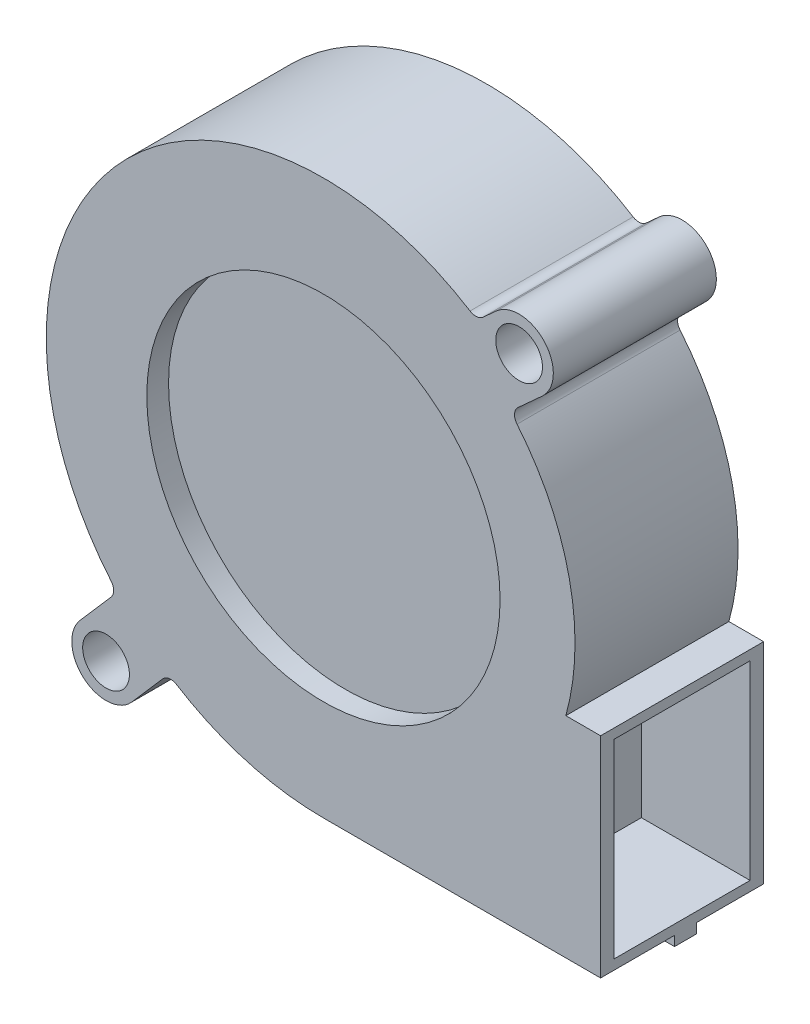
ISO-10303-21;
HEADER;
FILE_DESCRIPTION(('STEP AP214'),'2;1');
FILE_NAME('part.step','',(''),(''),'','','');
FILE_SCHEMA(('AUTOMOTIVE_DESIGN { 1 0 10303 214 1 1 1 1 }'));
ENDSEC;
DATA;
#1=APPLICATION_CONTEXT('core data for automotive mechanical design processes');
#2=APPLICATION_PROTOCOL_DEFINITION('international standard','automotive_design',2000,#1);
#3=PRODUCT_CONTEXT('',#1,'mechanical');
#4=PRODUCT('Part','Part','',(#3));
#5=PRODUCT_RELATED_PRODUCT_CATEGORY('part','',(#4));
#6=PRODUCT_DEFINITION_FORMATION('','',#4);
#7=PRODUCT_DEFINITION_CONTEXT('part definition',#1,'design');
#8=PRODUCT_DEFINITION('design','',#6,#7);
#9=PRODUCT_DEFINITION_SHAPE('','',#8);
#10=(LENGTH_UNIT() NAMED_UNIT(*) SI_UNIT(.MILLI.,.METRE.));
#11=(NAMED_UNIT(*) PLANE_ANGLE_UNIT() SI_UNIT($,.RADIAN.));
#12=(NAMED_UNIT(*) SI_UNIT($,.STERADIAN.) SOLID_ANGLE_UNIT());
#13=UNCERTAINTY_MEASURE_WITH_UNIT(LENGTH_MEASURE(1.E-05),#10,'distance_accuracy_value','');
#14=(GEOMETRIC_REPRESENTATION_CONTEXT(3) GLOBAL_UNCERTAINTY_ASSIGNED_CONTEXT((#13)) GLOBAL_UNIT_ASSIGNED_CONTEXT((#10,
#11,#12)) REPRESENTATION_CONTEXT('',''));
#15=CARTESIAN_POINT('',(0.,0.,0.));
#16=DIRECTION('',(0.,0.,1.));
#17=DIRECTION('',(1.,0.,0.));
#18=AXIS2_PLACEMENT_3D('',#15,#16,#17);
#19=CARTESIAN_POINT('',(-4.17823720879433,4.59639564959305,7.5));
#20=DIRECTION('',(0.67264597252616,-0.739964455662795,0.));
#21=DIRECTION('',(0.739964455662795,0.67264597252616,0.));
#22=AXIS2_PLACEMENT_3D('',#19,#20,#21);
#23=PLANE('',#22);
#24=DIRECTION('',(-0.739964455662795,-0.67264597252616,0.));
#25=VECTOR('',#24,1.);
#26=CARTESIAN_POINT('',(-4.17823720879433,4.59639564959305,-7.5));
#27=LINE('',#26,#25);
#28=CARTESIAN_POINT('',(15.8811651865426,22.8308880353378,-7.5));
#29=VERTEX_POINT('',#28);
#30=CARTESIAN_POINT('',(14.6907431403997,21.7487649835931,-7.5));
#31=VERTEX_POINT('',#30);
#32=EDGE_CURVE('E262',#29,#31,#27,.T.);
#33=ORIENTED_EDGE('',*,*,#32,.T.);
#34=DIRECTION('',(0.,0.,-1.));
#35=VECTOR('',#34,1.);
#36=CARTESIAN_POINT('',(14.6907431403997,21.7487649835931,7.5));
#37=LINE('',#36,#35);
#38=CARTESIAN_POINT('',(14.6907431403997,21.7487649835931,7.5));
#39=VERTEX_POINT('',#38);
#40=EDGE_CURVE('E11',#39,#31,#37,.T.);
#41=ORIENTED_EDGE('',*,*,#40,.F.);
#42=DIRECTION('',(-0.739964455662795,-0.67264597252616,0.));
#43=VECTOR('',#42,1.);
#44=CARTESIAN_POINT('',(-4.17823720879433,4.59639564959305,7.5));
#45=LINE('',#44,#43);
#46=CARTESIAN_POINT('',(15.8811651865426,22.8308880353378,7.5));
#47=VERTEX_POINT('',#46);
#48=EDGE_CURVE('E268',#47,#39,#45,.T.);
#49=ORIENTED_EDGE('',*,*,#48,.F.);
#50=DIRECTION('',(0.,0.,-1.));
#51=VECTOR('',#50,1.);
#52=CARTESIAN_POINT('',(15.8811651865426,22.8308880353378,7.5));
#53=LINE('',#52,#51);
#54=EDGE_CURVE('E311',#47,#29,#53,.T.);
#55=ORIENTED_EDGE('',*,*,#54,.T.);
#56=EDGE_LOOP('',(#33,#41,#49,#55));
#57=FACE_BOUND('',#56,.T.);
#58=ADVANCED_FACE('F36',(#57),#23,.F.);
#59=CARTESIAN_POINT('',(14.0180971678735,22.4887294392559,7.5));
#60=DIRECTION('',(0.,0.,-1.));
#61=DIRECTION('',(-1.,0.,0.));
#62=AXIS2_PLACEMENT_3D('',#59,#60,#61);
#63=CYLINDRICAL_SURFACE('',#62,0.999999999999999);
#64=CARTESIAN_POINT('',(14.0180971678735,22.4887294392559,-7.5));
#65=DIRECTION('',(0.,0.,1.));
#66=DIRECTION('',(1.,0.,0.));
#67=AXIS2_PLACEMENT_3D('',#64,#65,#66);
#68=CIRCLE('',#67,0.999999999999999);
#69=CARTESIAN_POINT('',(13.4891123690858,21.6400981396614,-7.5));
#70=VERTEX_POINT('',#69);
#71=EDGE_CURVE('E314',#31,#70,#68,.F.);
#72=ORIENTED_EDGE('',*,*,#71,.T.);
#73=DIRECTION('',(0.,0.,-1.));
#74=VECTOR('',#73,1.);
#75=CARTESIAN_POINT('',(13.4891123690858,21.6400981396614,7.5));
#76=LINE('',#75,#74);
#77=CARTESIAN_POINT('',(13.4891123690858,21.6400981396614,7.5));
#78=VERTEX_POINT('',#77);
#79=EDGE_CURVE('E43',#78,#70,#76,.T.);
#80=ORIENTED_EDGE('',*,*,#79,.F.);
#81=CARTESIAN_POINT('',(14.0180971678735,22.4887294392559,7.5));
#82=DIRECTION('',(0.,0.,1.));
#83=DIRECTION('',(1.,0.,0.));
#84=AXIS2_PLACEMENT_3D('',#81,#82,#83);
#85=CIRCLE('',#84,0.999999999999999);
#86=EDGE_CURVE('E271',#39,#78,#85,.F.);
#87=ORIENTED_EDGE('',*,*,#86,.F.);
#88=ORIENTED_EDGE('',*,*,#40,.T.);
#89=EDGE_LOOP('',(#72,#80,#87,#88));
#90=FACE_BOUND('',#89,.T.);
#91=ADVANCED_FACE('F416',(#90),#63,.F.);
#92=CARTESIAN_POINT('',(0.,0.,7.5));
#93=DIRECTION('',(0.,0.,-1.));
#94=DIRECTION('',(-1.,0.,0.));
#95=AXIS2_PLACEMENT_3D('',#92,#93,#94);
#96=CYLINDRICAL_SURFACE('',#95,25.5);
#97=CARTESIAN_POINT('',(0.,0.,-7.5));
#98=DIRECTION('',(0.,0.,1.));
#99=DIRECTION('',(1.,0.,0.));
#100=AXIS2_PLACEMENT_3D('',#97,#98,#99);
#101=CIRCLE('',#100,25.5);
#102=CARTESIAN_POINT('',(-19.5395415831544,-16.3846365452573,-7.5));
#103=VERTEX_POINT('',#102);
#104=EDGE_CURVE('E316',#70,#103,#101,.T.);
#105=ORIENTED_EDGE('',*,*,#104,.T.);
#106=DIRECTION('',(0.,0.,-1.));
#107=VECTOR('',#106,1.);
#108=CARTESIAN_POINT('',(-19.5395415831544,-16.3846365452573,7.5));
#109=LINE('',#108,#107);
#110=CARTESIAN_POINT('',(-19.5395415831544,-16.3846365452573,7.5));
#111=VERTEX_POINT('',#110);
#112=EDGE_CURVE('E389',#111,#103,#109,.T.);
#113=ORIENTED_EDGE('',*,*,#112,.F.);
#114=CARTESIAN_POINT('',(0.,0.,7.5));
#115=DIRECTION('',(0.,0.,1.));
#116=DIRECTION('',(1.,0.,0.));
#117=AXIS2_PLACEMENT_3D('',#114,#115,#116);
#118=CIRCLE('',#117,25.5);
#119=EDGE_CURVE('E274',#78,#111,#118,.T.);
#120=ORIENTED_EDGE('',*,*,#119,.F.);
#121=ORIENTED_EDGE('',*,*,#79,.T.);
#122=EDGE_LOOP('',(#105,#113,#120,#121));
#123=FACE_BOUND('',#122,.T.);
#124=ADVANCED_FACE('F396',(#123),#96,.T.);
#125=CARTESIAN_POINT('',(-20.3057981158271,-17.027171311738,7.5));
#126=DIRECTION('',(0.,0.,-1.));
#127=DIRECTION('',(-1.,0.,0.));
#128=AXIS2_PLACEMENT_3D('',#125,#126,#127);
#129=CYLINDRICAL_SURFACE('',#128,0.999999999999999);
#130=CARTESIAN_POINT('',(-20.3057981158271,-17.027171311738,-7.5));
#131=DIRECTION('',(0.,0.,1.));
#132=DIRECTION('',(1.,0.,0.));
#133=AXIS2_PLACEMENT_3D('',#130,#131,#132);
#134=CIRCLE('',#133,0.999999999999999);
#135=CARTESIAN_POINT('',(-19.5511925936636,-17.6833500266628,-7.5));
#136=VERTEX_POINT('',#135);
#137=EDGE_CURVE('E318',#103,#136,#134,.F.);
#138=ORIENTED_EDGE('',*,*,#137,.T.);
#139=DIRECTION('',(0.,0.,-1.));
#140=VECTOR('',#139,1.);
#141=CARTESIAN_POINT('',(-19.5511925936636,-17.6833500266628,7.5));
#142=LINE('',#141,#140);
#143=CARTESIAN_POINT('',(-19.5511925936636,-17.6833500266628,7.5));
#144=VERTEX_POINT('',#143);
#145=EDGE_CURVE('E387',#144,#136,#142,.T.);
#146=ORIENTED_EDGE('',*,*,#145,.F.);
#147=CARTESIAN_POINT('',(-20.3057981158271,-17.027171311738,7.5));
#148=DIRECTION('',(0.,0.,1.));
#149=DIRECTION('',(1.,0.,0.));
#150=AXIS2_PLACEMENT_3D('',#147,#148,#149);
#151=CIRCLE('',#150,0.999999999999999);
#152=EDGE_CURVE('E276',#111,#144,#151,.F.);
#153=ORIENTED_EDGE('',*,*,#152,.F.);
#154=ORIENTED_EDGE('',*,*,#112,.T.);
#155=EDGE_LOOP('',(#138,#146,#153,#154));
#156=FACE_BOUND('',#155,.T.);
#157=ADVANCED_FACE('F408',(#156),#129,.F.);
#158=CARTESIAN_POINT('',(-2.377007394815,2.06696295201305,7.5));
#159=DIRECTION('',(-0.754605522163504,0.656178714924788,0.));
#160=DIRECTION('',(-0.656178714924788,-0.754605522163504,0.));
#161=AXIS2_PLACEMENT_3D('',#158,#159,#160);
#162=PLANE('',#161);
#163=DIRECTION('',(0.656178714924788,0.754605522163504,0.));
#164=VECTOR('',#163,1.);
#165=CARTESIAN_POINT('',(-2.377007394815,2.06696295201305,-7.5));
#166=LINE('',#165,#164);
#167=CARTESIAN_POINT('',(-22.377007394815,-20.9330370479869,-7.5));
#168=VERTEX_POINT('',#167);
#169=EDGE_CURVE('E321',#168,#136,#166,.T.);
#170=ORIENTED_EDGE('',*,*,#169,.F.);
#171=DIRECTION('',(0.,0.,-1.));
#172=VECTOR('',#171,1.);
#173=CARTESIAN_POINT('',(-22.377007394815,-20.9330370479869,7.5));
#174=LINE('',#173,#172);
#175=CARTESIAN_POINT('',(-22.377007394815,-20.9330370479869,7.5));
#176=VERTEX_POINT('',#175);
#177=EDGE_CURVE('E385',#176,#168,#174,.T.);
#178=ORIENTED_EDGE('',*,*,#177,.F.);
#179=DIRECTION('',(0.656178714924788,0.754605522163504,0.));
#180=VECTOR('',#179,1.);
#181=CARTESIAN_POINT('',(-2.377007394815,2.06696295201305,7.5));
#182=LINE('',#181,#180);
#183=EDGE_CURVE('E278',#176,#144,#182,.T.);
#184=ORIENTED_EDGE('',*,*,#183,.T.);
#185=ORIENTED_EDGE('',*,*,#145,.T.);
#186=EDGE_LOOP('',(#170,#178,#184,#185));
#187=FACE_BOUND('',#186,.T.);
#188=ADVANCED_FACE('F471',(#187),#162,.T.);
#189=CARTESIAN_POINT('',(-20.,-23.,7.5));
#190=DIRECTION('',(0.,0.,-1.));
#191=DIRECTION('',(-1.,0.,0.));
#192=AXIS2_PLACEMENT_3D('',#189,#190,#191);
#193=CYLINDRICAL_SURFACE('',#192,3.15);
#194=CARTESIAN_POINT('',(-20.,-23.,-7.5));
#195=DIRECTION('',(0.,0.,1.));
#196=DIRECTION('',(1.,0.,0.));
#197=AXIS2_PLACEMENT_3D('',#194,#195,#196);
#198=CIRCLE('',#197,3.15);
#199=CARTESIAN_POINT('',(-17.622992605185,-25.0669629520131,-7.5));
#200=VERTEX_POINT('',#199);
#201=EDGE_CURVE('E324',#168,#200,#198,.T.);
#202=ORIENTED_EDGE('',*,*,#201,.T.);
#203=DIRECTION('',(0.,0.,-1.));
#204=VECTOR('',#203,1.);
#205=CARTESIAN_POINT('',(-17.622992605185,-25.0669629520131,7.5));
#206=LINE('',#205,#204);
#207=CARTESIAN_POINT('',(-17.622992605185,-25.0669629520131,7.5));
#208=VERTEX_POINT('',#207);
#209=EDGE_CURVE('E382',#208,#200,#206,.T.);
#210=ORIENTED_EDGE('',*,*,#209,.F.);
#211=CARTESIAN_POINT('',(-20.,-23.,7.5));
#212=DIRECTION('',(0.,0.,1.));
#213=DIRECTION('',(1.,0.,0.));
#214=AXIS2_PLACEMENT_3D('',#211,#212,#213);
#215=CIRCLE('',#214,3.15);
#216=EDGE_CURVE('E281',#176,#208,#215,.T.);
#217=ORIENTED_EDGE('',*,*,#216,.F.);
#218=ORIENTED_EDGE('',*,*,#177,.T.);
#219=EDGE_LOOP('',(#202,#210,#217,#218));
#220=FACE_BOUND('',#219,.T.);
#221=ADVANCED_FACE('F469',(#220),#193,.T.);
#222=CARTESIAN_POINT('',(2.37700739481505,-2.06696295201309,7.5));
#223=DIRECTION('',(-0.754605522163504,0.656178714924787,0.));
#224=DIRECTION('',(-0.656178714924787,-0.754605522163505,0.));
#225=AXIS2_PLACEMENT_3D('',#222,#223,#224);
#226=PLANE('',#225);
#227=DIRECTION('',(0.656178714924787,0.754605522163505,0.));
#228=VECTOR('',#227,1.);
#229=CARTESIAN_POINT('',(2.37700739481505,-2.06696295201309,-7.5));
#230=LINE('',#229,#228);
#231=CARTESIAN_POINT('',(-14.7971778040335,-21.8172759306889,-7.5));
#232=VERTEX_POINT('',#231);
#233=EDGE_CURVE('E326',#200,#232,#230,.T.);
#234=ORIENTED_EDGE('',*,*,#233,.T.);
#235=DIRECTION('',(0.,0.,-1.));
#236=VECTOR('',#235,1.);
#237=CARTESIAN_POINT('',(-14.7971778040335,-21.8172759306889,7.5));
#238=LINE('',#237,#236);
#239=CARTESIAN_POINT('',(-14.7971778040335,-21.8172759306889,7.5));
#240=VERTEX_POINT('',#239);
#241=EDGE_CURVE('E379',#240,#232,#238,.T.);
#242=ORIENTED_EDGE('',*,*,#241,.F.);
#243=DIRECTION('',(0.656178714924787,0.754605522163505,0.));
#244=VECTOR('',#243,1.);
#245=CARTESIAN_POINT('',(2.37700739481505,-2.06696295201309,7.5));
#246=LINE('',#245,#244);
#247=EDGE_CURVE('E283',#208,#240,#246,.T.);
#248=ORIENTED_EDGE('',*,*,#247,.F.);
#249=ORIENTED_EDGE('',*,*,#209,.T.);
#250=EDGE_LOOP('',(#234,#242,#248,#249));
#251=FACE_BOUND('',#250,.T.);
#252=ADVANCED_FACE('F465',(#251),#226,.F.);
#253=CARTESIAN_POINT('',(-14.04257228187,-22.4734546456137,7.5));
#254=DIRECTION('',(0.,0.,-1.));
#255=DIRECTION('',(-1.,0.,0.));
#256=AXIS2_PLACEMENT_3D('',#253,#254,#255);
#257=CYLINDRICAL_SURFACE('',#256,0.999999999999999);
#258=CARTESIAN_POINT('',(-14.04257228187,-22.4734546456137,-7.5));
#259=DIRECTION('',(0.,0.,1.));
#260=DIRECTION('',(1.,0.,0.));
#261=AXIS2_PLACEMENT_3D('',#258,#259,#260);
#262=CIRCLE('',#261,0.999999999999999);
#263=CARTESIAN_POINT('',(-13.5126638938749,-21.6253997533264,-7.5));
#264=VERTEX_POINT('',#263);
#265=EDGE_CURVE('E328',#232,#264,#262,.F.);
#266=ORIENTED_EDGE('',*,*,#265,.T.);
#267=DIRECTION('',(0.,0.,-1.));
#268=VECTOR('',#267,1.);
#269=CARTESIAN_POINT('',(-13.5126638938749,-21.6253997533264,7.5));
#270=LINE('',#269,#268);
#271=CARTESIAN_POINT('',(-13.5126638938749,-21.6253997533264,7.5));
#272=VERTEX_POINT('',#271);
#273=EDGE_CURVE('E376',#272,#264,#270,.T.);
#274=ORIENTED_EDGE('',*,*,#273,.F.);
#275=CARTESIAN_POINT('',(-14.04257228187,-22.4734546456137,7.5));
#276=DIRECTION('',(0.,0.,1.));
#277=DIRECTION('',(1.,0.,0.));
#278=AXIS2_PLACEMENT_3D('',#275,#276,#277);
#279=CIRCLE('',#278,0.999999999999999);
#280=EDGE_CURVE('E285',#240,#272,#279,.F.);
#281=ORIENTED_EDGE('',*,*,#280,.F.);
#282=ORIENTED_EDGE('',*,*,#241,.T.);
#283=EDGE_LOOP('',(#266,#274,#281,#282));
#284=FACE_BOUND('',#283,.T.);
#285=ADVANCED_FACE('F460',(#284),#257,.F.);
#286=CARTESIAN_POINT('',(0.,0.,7.5));
#287=DIRECTION('',(0.,0.,-1.));
#288=DIRECTION('',(-1.,0.,0.));
#289=AXIS2_PLACEMENT_3D('',#286,#287,#288);
#290=CYLINDRICAL_SURFACE('',#289,25.5);
#291=CARTESIAN_POINT('',(0.,0.,-7.5));
#292=DIRECTION('',(0.,0.,1.));
#293=DIRECTION('',(1.,0.,0.));
#294=AXIS2_PLACEMENT_3D('',#291,#292,#293);
#295=CIRCLE('',#294,25.5);
#296=CARTESIAN_POINT('',(0.,-25.5,-7.5));
#297=VERTEX_POINT('',#296);
#298=EDGE_CURVE('E330',#264,#297,#295,.T.);
#299=ORIENTED_EDGE('',*,*,#298,.T.);
#300=DIRECTION('',(0.,0.,-1.));
#301=VECTOR('',#300,1.);
#302=CARTESIAN_POINT('',(0.,-25.5,7.5));
#303=LINE('',#302,#301);
#304=CARTESIAN_POINT('',(0.,-25.5,7.5));
#305=VERTEX_POINT('',#304);
#306=EDGE_CURVE('E374',#305,#297,#303,.T.);
#307=ORIENTED_EDGE('',*,*,#306,.F.);
#308=CARTESIAN_POINT('',(0.,0.,7.5));
#309=DIRECTION('',(0.,0.,1.));
#310=DIRECTION('',(1.,0.,0.));
#311=AXIS2_PLACEMENT_3D('',#308,#309,#310);
#312=CIRCLE('',#311,25.5);
#313=EDGE_CURVE('E287',#272,#305,#312,.T.);
#314=ORIENTED_EDGE('',*,*,#313,.F.);
#315=ORIENTED_EDGE('',*,*,#273,.T.);
#316=EDGE_LOOP('',(#299,#307,#314,#315));
#317=FACE_BOUND('',#316,.T.);
#318=ADVANCED_FACE('F455',(#317),#290,.T.);
#319=CARTESIAN_POINT('',(0.,-25.5,7.5));
#320=DIRECTION('',(0.,-1.,0.));
#321=DIRECTION('',(1.,0.,0.));
#322=AXIS2_PLACEMENT_3D('',#319,#320,#321);
#323=PLANE('',#322);
#324=DIRECTION('',(1.,0.,0.));
#325=VECTOR('',#324,1.);
#326=CARTESIAN_POINT('',(14.1,-25.5,0.699999999999999));
#327=LINE('',#326,#325);
#328=CARTESIAN_POINT('',(14.1,-25.5,0.699999999999999));
#329=VERTEX_POINT('',#328);
#330=CARTESIAN_POINT('',(25.5,-25.5,0.699999999999999));
#331=VERTEX_POINT('',#330);
#332=EDGE_CURVE('E259',#329,#331,#327,.T.);
#333=ORIENTED_EDGE('',*,*,#332,.T.);
#334=DIRECTION('',(0.,0.,-1.));
#335=VECTOR('',#334,1.);
#336=CARTESIAN_POINT('',(25.5,-25.5,7.5));
#337=LINE('',#336,#335);
#338=CARTESIAN_POINT('',(25.5,-25.5,7.5));
#339=VERTEX_POINT('',#338);
#340=EDGE_CURVE('E371',#339,#331,#337,.T.);
#341=ORIENTED_EDGE('',*,*,#340,.F.);
#342=DIRECTION('',(-1.,0.,0.));
#343=VECTOR('',#342,1.);
#344=CARTESIAN_POINT('',(0.,-25.5,7.5));
#345=LINE('',#344,#343);
#346=EDGE_CURVE('E289',#339,#305,#345,.T.);
#347=ORIENTED_EDGE('',*,*,#346,.T.);
#348=ORIENTED_EDGE('',*,*,#306,.T.);
#349=DIRECTION('',(-1.,0.,0.));
#350=VECTOR('',#349,1.);
#351=CARTESIAN_POINT('',(0.,-25.5,-7.5));
#352=LINE('',#351,#350);
#353=CARTESIAN_POINT('',(25.5,-25.5,-7.5));
#354=VERTEX_POINT('',#353);
#355=EDGE_CURVE('E333',#354,#297,#352,.T.);
#356=ORIENTED_EDGE('',*,*,#355,.F.);
#357=CARTESIAN_POINT('',(25.5,-25.5,-1.3));
#358=VERTEX_POINT('',#357);
#359=EDGE_CURVE('E370',#358,#354,#337,.T.);
#360=ORIENTED_EDGE('',*,*,#359,.F.);
#361=DIRECTION('',(1.,0.,0.));
#362=VECTOR('',#361,1.);
#363=CARTESIAN_POINT('',(14.1,-25.5,-1.3));
#364=LINE('',#363,#362);
#365=CARTESIAN_POINT('',(14.1,-25.5,-1.3));
#366=VERTEX_POINT('',#365);
#367=EDGE_CURVE('E263',#366,#358,#364,.T.);
#368=ORIENTED_EDGE('',*,*,#367,.F.);
#369=DIRECTION('',(0.,0.,1.));
#370=VECTOR('',#369,1.);
#371=CARTESIAN_POINT('',(14.1,-25.5,0.699999999999999));
#372=LINE('',#371,#370);
#373=EDGE_CURVE('E250',#366,#329,#372,.T.);
#374=ORIENTED_EDGE('',*,*,#373,.T.);
#375=EDGE_LOOP('',(#333,#341,#347,#348,#356,#360,#368,#374));
#376=FACE_BOUND('',#375,.T.);
#377=ADVANCED_FACE('F450',(#376),#323,.T.);
#378=CARTESIAN_POINT('',(25.5,0.,7.5));
#379=DIRECTION('',(-1.,0.,0.));
#380=DIRECTION('',(0.,-1.,0.));
#381=AXIS2_PLACEMENT_3D('',#378,#379,#380);
#382=PLANE('',#381);
#383=DIRECTION('',(0.,0.,-1.));
#384=VECTOR('',#383,1.);
#385=CARTESIAN_POINT('',(25.5,-24.6,6.25));
#386=LINE('',#385,#384);
#387=CARTESIAN_POINT('',(25.5,-24.6,6.25));
#388=VERTEX_POINT('',#387);
#389=CARTESIAN_POINT('',(25.5,-24.6,-6.25));
#390=VERTEX_POINT('',#389);
#391=EDGE_CURVE('E226',#388,#390,#386,.T.);
#392=ORIENTED_EDGE('',*,*,#391,.F.);
#393=DIRECTION('',(0.,-1.,0.));
#394=VECTOR('',#393,1.);
#395=CARTESIAN_POINT('',(25.5,-7.09999999999999,6.25));
#396=LINE('',#395,#394);
#397=CARTESIAN_POINT('',(25.5,-7.09999999999999,6.25));
#398=VERTEX_POINT('',#397);
#399=EDGE_CURVE('E50',#398,#388,#396,.T.);
#400=ORIENTED_EDGE('',*,*,#399,.F.);
#401=DIRECTION('',(0.,0.,1.));
#402=VECTOR('',#401,1.);
#403=CARTESIAN_POINT('',(25.5,-7.09999999999999,6.25));
#404=LINE('',#403,#402);
#405=CARTESIAN_POINT('',(25.5,-7.09999999999999,-6.25));
#406=VERTEX_POINT('',#405);
#407=EDGE_CURVE('E217',#406,#398,#404,.T.);
#408=ORIENTED_EDGE('',*,*,#407,.F.);
#409=DIRECTION('',(0.,1.,0.));
#410=VECTOR('',#409,1.);
#411=CARTESIAN_POINT('',(25.5,-7.09999999999999,-6.25));
#412=LINE('',#411,#410);
#413=EDGE_CURVE('E220',#390,#406,#412,.T.);
#414=ORIENTED_EDGE('',*,*,#413,.F.);
#415=EDGE_LOOP('',(#392,#400,#408,#414));
#416=FACE_BOUND('',#415,.T.);
#417=DIRECTION('',(0.,1.,0.));
#418=VECTOR('',#417,1.);
#419=CARTESIAN_POINT('',(25.5,0.,-7.5));
#420=LINE('',#419,#418);
#421=CARTESIAN_POINT('',(25.5,-6.19999999999999,-7.5));
#422=VERTEX_POINT('',#421);
#423=EDGE_CURVE('E336',#354,#422,#420,.T.);
#424=ORIENTED_EDGE('',*,*,#423,.T.);
#425=DIRECTION('',(0.,0.,-1.));
#426=VECTOR('',#425,1.);
#427=CARTESIAN_POINT('',(25.5,-6.19999999999999,7.5));
#428=LINE('',#427,#426);
#429=CARTESIAN_POINT('',(25.5,-6.19999999999999,7.5));
#430=VERTEX_POINT('',#429);
#431=EDGE_CURVE('E367',#430,#422,#428,.T.);
#432=ORIENTED_EDGE('',*,*,#431,.F.);
#433=DIRECTION('',(0.,1.,0.));
#434=VECTOR('',#433,1.);
#435=CARTESIAN_POINT('',(25.5,0.,7.5));
#436=LINE('',#435,#434);
#437=EDGE_CURVE('E292',#339,#430,#436,.T.);
#438=ORIENTED_EDGE('',*,*,#437,.F.);
#439=ORIENTED_EDGE('',*,*,#340,.T.);
#440=DIRECTION('',(0.,-1.,0.));
#441=VECTOR('',#440,1.);
#442=CARTESIAN_POINT('',(25.5,-25.5,0.699999999999999));
#443=LINE('',#442,#441);
#444=CARTESIAN_POINT('',(25.5,-26.4,0.699999999999999));
#445=VERTEX_POINT('',#444);
#446=EDGE_CURVE('E239',#331,#445,#443,.T.);
#447=ORIENTED_EDGE('',*,*,#446,.T.);
#448=DIRECTION('',(0.,0.,-1.));
#449=VECTOR('',#448,1.);
#450=CARTESIAN_POINT('',(25.5,-26.4,0.699999999999999));
#451=LINE('',#450,#449);
#452=CARTESIAN_POINT('',(25.5,-26.4,-1.3));
#453=VERTEX_POINT('',#452);
#454=EDGE_CURVE('E256',#445,#453,#451,.T.);
#455=ORIENTED_EDGE('',*,*,#454,.T.);
#456=DIRECTION('',(0.,1.,0.));
#457=VECTOR('',#456,1.);
#458=CARTESIAN_POINT('',(25.5,-25.5,-1.3));
#459=LINE('',#458,#457);
#460=EDGE_CURVE('E58',#453,#358,#459,.T.);
#461=ORIENTED_EDGE('',*,*,#460,.T.);
#462=ORIENTED_EDGE('',*,*,#359,.T.);
#463=EDGE_LOOP('',(#424,#432,#438,#439,#447,#455,#461,#462));
#464=FACE_BOUND('',#463,.T.);
#465=ADVANCED_FACE('F444',(#416,#464),#382,.F.);
#466=CARTESIAN_POINT('',(0.,-6.19999999999999,7.5));
#467=DIRECTION('',(0.,-1.,0.));
#468=DIRECTION('',(1.,0.,0.));
#469=AXIS2_PLACEMENT_3D('',#466,#467,#468);
#470=PLANE('',#469);
#471=DIRECTION('',(-1.,0.,0.));
#472=VECTOR('',#471,1.);
#473=CARTESIAN_POINT('',(0.,-6.19999999999999,-7.5));
#474=LINE('',#473,#472);
#475=CARTESIAN_POINT('',(22.3,-6.19999999999999,-7.5));
#476=VERTEX_POINT('',#475);
#477=EDGE_CURVE('E338',#422,#476,#474,.T.);
#478=ORIENTED_EDGE('',*,*,#477,.T.);
#479=DIRECTION('',(0.,0.,-1.));
#480=VECTOR('',#479,1.);
#481=CARTESIAN_POINT('',(22.3,-6.19999999999999,7.5));
#482=LINE('',#481,#480);
#483=CARTESIAN_POINT('',(22.3,-6.19999999999999,7.5));
#484=VERTEX_POINT('',#483);
#485=EDGE_CURVE('E364',#484,#476,#482,.T.);
#486=ORIENTED_EDGE('',*,*,#485,.F.);
#487=DIRECTION('',(-1.,0.,0.));
#488=VECTOR('',#487,1.);
#489=CARTESIAN_POINT('',(0.,-6.19999999999999,7.5));
#490=LINE('',#489,#488);
#491=EDGE_CURVE('E294',#430,#484,#490,.T.);
#492=ORIENTED_EDGE('',*,*,#491,.F.);
#493=ORIENTED_EDGE('',*,*,#431,.T.);
#494=EDGE_LOOP('',(#478,#486,#492,#493));
#495=FACE_BOUND('',#494,.T.);
#496=ADVANCED_FACE('F441',(#495),#470,.F.);
#497=CARTESIAN_POINT('',(0.,0.,7.5));
#498=DIRECTION('',(0.,0.,-1.));
#499=DIRECTION('',(-1.,0.,0.));
#500=AXIS2_PLACEMENT_3D('',#497,#498,#499);
#501=CYLINDRICAL_SURFACE('',#500,23.1458419591943);
#502=CARTESIAN_POINT('',(0.,0.,-7.5));
#503=DIRECTION('',(0.,0.,1.));
#504=DIRECTION('',(1.,0.,0.));
#505=AXIS2_PLACEMENT_3D('',#502,#503,#504);
#506=CIRCLE('',#505,23.1458419591943);
#507=CARTESIAN_POINT('',(17.81145238904,14.781142168079,-7.5));
#508=VERTEX_POINT('',#507);
#509=EDGE_CURVE('E340',#476,#508,#506,.T.);
#510=ORIENTED_EDGE('',*,*,#509,.T.);
#511=DIRECTION('',(0.,0.,-1.));
#512=VECTOR('',#511,1.);
#513=CARTESIAN_POINT('',(17.81145238904,14.781142168079,7.5));
#514=LINE('',#513,#512);
#515=CARTESIAN_POINT('',(17.81145238904,14.781142168079,7.5));
#516=VERTEX_POINT('',#515);
#517=EDGE_CURVE('E361',#516,#508,#514,.T.);
#518=ORIENTED_EDGE('',*,*,#517,.F.);
#519=CARTESIAN_POINT('',(0.,0.,7.5));
#520=DIRECTION('',(0.,0.,1.));
#521=DIRECTION('',(1.,0.,0.));
#522=AXIS2_PLACEMENT_3D('',#519,#520,#521);
#523=CIRCLE('',#522,23.1458419591943);
#524=EDGE_CURVE('E296',#484,#516,#523,.T.);
#525=ORIENTED_EDGE('',*,*,#524,.F.);
#526=ORIENTED_EDGE('',*,*,#485,.T.);
#527=EDGE_LOOP('',(#510,#518,#525,#526));
#528=FACE_BOUND('',#527,.T.);
#529=ADVANCED_FACE('F436',(#528),#501,.T.);
#530=CARTESIAN_POINT('',(18.5809837986314,15.419751132667,7.5));
#531=DIRECTION('',(0.,0.,-1.));
#532=DIRECTION('',(-1.,0.,0.));
#533=AXIS2_PLACEMENT_3D('',#530,#531,#532);
#534=CYLINDRICAL_SURFACE('',#533,0.999999999999999);
#535=CARTESIAN_POINT('',(18.5809837986314,15.419751132667,-7.5));
#536=DIRECTION('',(0.,0.,1.));
#537=DIRECTION('',(1.,0.,0.));
#538=AXIS2_PLACEMENT_3D('',#535,#536,#537);
#539=CIRCLE('',#538,0.999999999999999);
#540=CARTESIAN_POINT('',(17.9083378261053,16.1597155883298,-7.5));
#541=VERTEX_POINT('',#540);
#542=EDGE_CURVE('E342',#508,#541,#539,.F.);
#543=ORIENTED_EDGE('',*,*,#542,.T.);
#544=DIRECTION('',(0.,0.,-1.));
#545=VECTOR('',#544,1.);
#546=CARTESIAN_POINT('',(17.9083378261053,16.1597155883298,7.5));
#547=LINE('',#546,#545);
#548=CARTESIAN_POINT('',(17.9083378261053,16.1597155883298,7.5));
#549=VERTEX_POINT('',#548);
#550=EDGE_CURVE('E359',#549,#541,#547,.T.);
#551=ORIENTED_EDGE('',*,*,#550,.F.);
#552=CARTESIAN_POINT('',(18.5809837986314,15.419751132667,7.5));
#553=DIRECTION('',(0.,0.,1.));
#554=DIRECTION('',(1.,0.,0.));
#555=AXIS2_PLACEMENT_3D('',#552,#553,#554);
#556=CIRCLE('',#555,0.999999999999999);
#557=EDGE_CURVE('E298',#516,#549,#556,.F.);
#558=ORIENTED_EDGE('',*,*,#557,.F.);
#559=ORIENTED_EDGE('',*,*,#517,.T.);
#560=EDGE_LOOP('',(#543,#551,#558,#559));
#561=FACE_BOUND('',#560,.T.);
#562=ADVANCED_FACE('F430',(#561),#534,.F.);
#563=CARTESIAN_POINT('',(0.0594324181204341,-0.0653804210825041,7.5));
#564=DIRECTION('',(0.672645972526158,-0.739964455662796,0.));
#565=DIRECTION('',(0.739964455662796,0.672645972526158,0.));
#566=AXIS2_PLACEMENT_3D('',#563,#564,#565);
#567=PLANE('',#566);
#568=DIRECTION('',(-0.739964455662796,-0.672645972526158,0.));
#569=VECTOR('',#568,1.);
#570=CARTESIAN_POINT('',(0.0594324181204341,-0.0653804210825041,-7.5));
#571=LINE('',#570,#569);
#572=CARTESIAN_POINT('',(20.1188348134574,18.1691119646622,-7.5));
#573=VERTEX_POINT('',#572);
#574=EDGE_CURVE('E345',#573,#541,#571,.T.);
#575=ORIENTED_EDGE('',*,*,#574,.F.);
#576=DIRECTION('',(0.,0.,-1.));
#577=VECTOR('',#576,1.);
#578=CARTESIAN_POINT('',(20.1188348134574,18.1691119646622,7.5));
#579=LINE('',#578,#577);
#580=CARTESIAN_POINT('',(20.1188348134574,18.1691119646622,7.5));
#581=VERTEX_POINT('',#580);
#582=EDGE_CURVE('E357',#581,#573,#579,.T.);
#583=ORIENTED_EDGE('',*,*,#582,.F.);
#584=DIRECTION('',(-0.739964455662796,-0.672645972526158,0.));
#585=VECTOR('',#584,1.);
#586=CARTESIAN_POINT('',(0.0594324181204341,-0.0653804210825041,7.5));
#587=LINE('',#586,#585);
#588=EDGE_CURVE('E300',#581,#549,#587,.T.);
#589=ORIENTED_EDGE('',*,*,#588,.T.);
#590=ORIENTED_EDGE('',*,*,#550,.T.);
#591=EDGE_LOOP('',(#575,#583,#589,#590));
#592=FACE_BOUND('',#591,.T.);
#593=ADVANCED_FACE('F424',(#592),#567,.T.);
#594=CARTESIAN_POINT('',(18.,20.5,7.5));
#595=DIRECTION('',(0.,0.,-1.));
#596=DIRECTION('',(-1.,0.,0.));
#597=AXIS2_PLACEMENT_3D('',#594,#595,#596);
#598=CYLINDRICAL_SURFACE('',#597,2.15);
#599=CARTESIAN_POINT('',(18.,20.5,7.5));
#600=DIRECTION('',(0.,0.,1.));
#601=DIRECTION('',(1.,0.,0.));
#602=AXIS2_PLACEMENT_3D('',#599,#600,#601);
#603=CIRCLE('',#602,2.15);
#604=CARTESIAN_POINT('',(20.15,20.5,7.5));
#605=VERTEX_POINT('',#604);
#606=EDGE_CURVE('E305',#605,#605,#603,.T.);
#607=ORIENTED_EDGE('',*,*,#606,.T.);
#608=EDGE_LOOP('',(#607));
#609=FACE_BOUND('',#608,.T.);
#610=CARTESIAN_POINT('',(18.,20.5,-7.5));
#611=DIRECTION('',(0.,0.,1.));
#612=DIRECTION('',(1.,0.,0.));
#613=AXIS2_PLACEMENT_3D('',#610,#611,#612);
#614=CIRCLE('',#613,2.15);
#615=CARTESIAN_POINT('',(20.15,20.5,-7.5));
#616=VERTEX_POINT('',#615);
#617=EDGE_CURVE('E350',#616,#616,#614,.T.);
#618=ORIENTED_EDGE('',*,*,#617,.F.);
#619=EDGE_LOOP('',(#618));
#620=FACE_BOUND('',#619,.T.);
#621=ADVANCED_FACE('F566',(#609,#620),#598,.F.);
#622=CARTESIAN_POINT('',(18.,20.5,7.5));
#623=DIRECTION('',(0.,0.,-1.));
#624=DIRECTION('',(-1.,0.,0.));
#625=AXIS2_PLACEMENT_3D('',#622,#623,#624);
#626=CYLINDRICAL_SURFACE('',#625,3.15);
#627=CARTESIAN_POINT('',(18.,20.5,-7.5));
#628=DIRECTION('',(0.,0.,1.));
#629=DIRECTION('',(1.,0.,0.));
#630=AXIS2_PLACEMENT_3D('',#627,#628,#629);
#631=CIRCLE('',#630,3.15);
#632=EDGE_CURVE('E348',#573,#29,#631,.T.);
#633=ORIENTED_EDGE('',*,*,#632,.T.);
#634=ORIENTED_EDGE('',*,*,#54,.F.);
#635=CARTESIAN_POINT('',(18.,20.5,7.5));
#636=DIRECTION('',(0.,0.,1.));
#637=DIRECTION('',(1.,0.,0.));
#638=AXIS2_PLACEMENT_3D('',#635,#636,#637);
#639=CIRCLE('',#638,3.15);
#640=EDGE_CURVE('E303',#581,#47,#639,.T.);
#641=ORIENTED_EDGE('',*,*,#640,.F.);
#642=ORIENTED_EDGE('',*,*,#582,.T.);
#643=EDGE_LOOP('',(#633,#634,#641,#642));
#644=FACE_BOUND('',#643,.T.);
#645=ADVANCED_FACE('F575',(#644),#626,.T.);
#646=CARTESIAN_POINT('',(-20.,-23.,7.5));
#647=DIRECTION('',(0.,0.,-1.));
#648=DIRECTION('',(-1.,0.,0.));
#649=AXIS2_PLACEMENT_3D('',#646,#647,#648);
#650=CYLINDRICAL_SURFACE('',#649,2.15);
#651=CARTESIAN_POINT('',(-20.,-23.,7.5));
#652=DIRECTION('',(0.,0.,1.));
#653=DIRECTION('',(1.,0.,0.));
#654=AXIS2_PLACEMENT_3D('',#651,#652,#653);
#655=CIRCLE('',#654,2.15);
#656=CARTESIAN_POINT('',(-17.85,-23.,7.5));
#657=VERTEX_POINT('',#656);
#658=EDGE_CURVE('E308',#657,#657,#655,.T.);
#659=ORIENTED_EDGE('',*,*,#658,.T.);
#660=EDGE_LOOP('',(#659));
#661=FACE_BOUND('',#660,.T.);
#662=CARTESIAN_POINT('',(-20.,-23.,-7.5));
#663=DIRECTION('',(0.,0.,1.));
#664=DIRECTION('',(1.,0.,0.));
#665=AXIS2_PLACEMENT_3D('',#662,#663,#664);
#666=CIRCLE('',#665,2.15);
#667=CARTESIAN_POINT('',(-17.85,-23.,-7.5));
#668=VERTEX_POINT('',#667);
#669=EDGE_CURVE('E272',#668,#668,#666,.T.);
#670=ORIENTED_EDGE('',*,*,#669,.F.);
#671=EDGE_LOOP('',(#670));
#672=FACE_BOUND('',#671,.T.);
#673=ADVANCED_FACE('F585',(#661,#672),#650,.F.);
#674=CARTESIAN_POINT('',(0.,0.,7.5));
#675=DIRECTION('',(0.,0.,1.));
#676=DIRECTION('',(1.,0.,0.));
#677=AXIS2_PLACEMENT_3D('',#674,#675,#676);
#678=PLANE('',#677);
#679=CARTESIAN_POINT('',(0.,0.,7.5));
#680=DIRECTION('',(0.,0.,1.));
#681=DIRECTION('',(1.,0.,0.));
#682=AXIS2_PLACEMENT_3D('',#679,#680,#681);
#683=CIRCLE('',#682,16.25);
#684=CARTESIAN_POINT('',(16.25,0.,7.5));
#685=VERTEX_POINT('',#684);
#686=EDGE_CURVE('E232',#685,#685,#683,.T.);
#687=ORIENTED_EDGE('',*,*,#686,.F.);
#688=EDGE_LOOP('',(#687));
#689=FACE_BOUND('',#688,.T.);
#690=ORIENTED_EDGE('',*,*,#48,.T.);
#691=ORIENTED_EDGE('',*,*,#86,.T.);
#692=ORIENTED_EDGE('',*,*,#119,.T.);
#693=ORIENTED_EDGE('',*,*,#152,.T.);
#694=ORIENTED_EDGE('',*,*,#183,.F.);
#695=ORIENTED_EDGE('',*,*,#216,.T.);
#696=ORIENTED_EDGE('',*,*,#247,.T.);
#697=ORIENTED_EDGE('',*,*,#280,.T.);
#698=ORIENTED_EDGE('',*,*,#313,.T.);
#699=ORIENTED_EDGE('',*,*,#346,.F.);
#700=ORIENTED_EDGE('',*,*,#437,.T.);
#701=ORIENTED_EDGE('',*,*,#491,.T.);
#702=ORIENTED_EDGE('',*,*,#524,.T.);
#703=ORIENTED_EDGE('',*,*,#557,.T.);
#704=ORIENTED_EDGE('',*,*,#588,.F.);
#705=ORIENTED_EDGE('',*,*,#640,.T.);
#706=EDGE_LOOP('',(#690,#691,#692,#693,#694,#695,#696,#697,#698,#699,#700,#701,#702,#703,#704,#705));
#707=FACE_BOUND('',#706,.T.);
#708=ORIENTED_EDGE('',*,*,#606,.F.);
#709=EDGE_LOOP('',(#708));
#710=FACE_BOUND('',#709,.T.);
#711=ORIENTED_EDGE('',*,*,#658,.F.);
#712=EDGE_LOOP('',(#711));
#713=FACE_BOUND('',#712,.T.);
#714=ADVANCED_FACE('F412',(#689,#707,#710,#713),#678,.T.);
#715=CARTESIAN_POINT('',(0.,0.,-7.5));
#716=DIRECTION('',(0.,0.,1.));
#717=DIRECTION('',(1.,0.,0.));
#718=AXIS2_PLACEMENT_3D('',#715,#716,#717);
#719=PLANE('',#718);
#720=ORIENTED_EDGE('',*,*,#32,.F.);
#721=ORIENTED_EDGE('',*,*,#632,.F.);
#722=ORIENTED_EDGE('',*,*,#574,.T.);
#723=ORIENTED_EDGE('',*,*,#542,.F.);
#724=ORIENTED_EDGE('',*,*,#509,.F.);
#725=ORIENTED_EDGE('',*,*,#477,.F.);
#726=ORIENTED_EDGE('',*,*,#423,.F.);
#727=ORIENTED_EDGE('',*,*,#355,.T.);
#728=ORIENTED_EDGE('',*,*,#298,.F.);
#729=ORIENTED_EDGE('',*,*,#265,.F.);
#730=ORIENTED_EDGE('',*,*,#233,.F.);
#731=ORIENTED_EDGE('',*,*,#201,.F.);
#732=ORIENTED_EDGE('',*,*,#169,.T.);
#733=ORIENTED_EDGE('',*,*,#137,.F.);
#734=ORIENTED_EDGE('',*,*,#104,.F.);
#735=ORIENTED_EDGE('',*,*,#71,.F.);
#736=EDGE_LOOP('',(#720,#721,#722,#723,#724,#725,#726,#727,#728,#729,#730,#731,#732,#733,#734,#735));
#737=FACE_BOUND('',#736,.T.);
#738=ORIENTED_EDGE('',*,*,#617,.T.);
#739=EDGE_LOOP('',(#738));
#740=FACE_BOUND('',#739,.T.);
#741=ORIENTED_EDGE('',*,*,#669,.T.);
#742=EDGE_LOOP('',(#741));
#743=FACE_BOUND('',#742,.T.);
#744=ADVANCED_FACE('F402',(#737,#740,#743),#719,.F.);
#745=CARTESIAN_POINT('',(14.1,-25.5,0.699999999999999));
#746=DIRECTION('',(0.,0.,1.));
#747=DIRECTION('',(0.,-1.,0.));
#748=AXIS2_PLACEMENT_3D('',#745,#746,#747);
#749=PLANE('',#748);
#750=ORIENTED_EDGE('',*,*,#446,.F.);
#751=ORIENTED_EDGE('',*,*,#332,.F.);
#752=DIRECTION('',(0.,-1.,0.));
#753=VECTOR('',#752,1.);
#754=CARTESIAN_POINT('',(14.1,-25.5,0.699999999999999));
#755=LINE('',#754,#753);
#756=CARTESIAN_POINT('',(14.1,-26.4,0.699999999999999));
#757=VERTEX_POINT('',#756);
#758=EDGE_CURVE('E242',#329,#757,#755,.T.);
#759=ORIENTED_EDGE('',*,*,#758,.T.);
#760=DIRECTION('',(1.,0.,0.));
#761=VECTOR('',#760,1.);
#762=CARTESIAN_POINT('',(14.1,-26.4,0.699999999999999));
#763=LINE('',#762,#761);
#764=EDGE_CURVE('E253',#757,#445,#763,.T.);
#765=ORIENTED_EDGE('',*,*,#764,.T.);
#766=EDGE_LOOP('',(#750,#751,#759,#765));
#767=FACE_BOUND('',#766,.T.);
#768=ADVANCED_FACE('F605',(#767),#749,.T.);
#769=CARTESIAN_POINT('',(14.1,-25.5,-1.3));
#770=DIRECTION('',(0.,0.,-1.));
#771=DIRECTION('',(0.,1.,0.));
#772=AXIS2_PLACEMENT_3D('',#769,#770,#771);
#773=PLANE('',#772);
#774=ORIENTED_EDGE('',*,*,#460,.F.);
#775=DIRECTION('',(1.,0.,0.));
#776=VECTOR('',#775,1.);
#777=CARTESIAN_POINT('',(14.1,-26.4,-1.3));
#778=LINE('',#777,#776);
#779=CARTESIAN_POINT('',(14.1,-26.4,-1.3));
#780=VERTEX_POINT('',#779);
#781=EDGE_CURVE('E265',#780,#453,#778,.T.);
#782=ORIENTED_EDGE('',*,*,#781,.F.);
#783=DIRECTION('',(0.,1.,0.));
#784=VECTOR('',#783,1.);
#785=CARTESIAN_POINT('',(14.1,-25.5,-1.3));
#786=LINE('',#785,#784);
#787=EDGE_CURVE('E248',#780,#366,#786,.T.);
#788=ORIENTED_EDGE('',*,*,#787,.T.);
#789=ORIENTED_EDGE('',*,*,#367,.T.);
#790=EDGE_LOOP('',(#774,#782,#788,#789));
#791=FACE_BOUND('',#790,.T.);
#792=ADVANCED_FACE('F622',(#791),#773,.T.);
#793=CARTESIAN_POINT('',(14.1,-26.4,0.699999999999999));
#794=DIRECTION('',(0.,-1.,0.));
#795=DIRECTION('',(1.,0.,0.));
#796=AXIS2_PLACEMENT_3D('',#793,#794,#795);
#797=PLANE('',#796);
#798=ORIENTED_EDGE('',*,*,#454,.F.);
#799=ORIENTED_EDGE('',*,*,#764,.F.);
#800=DIRECTION('',(0.,0.,-1.));
#801=VECTOR('',#800,1.);
#802=CARTESIAN_POINT('',(14.1,-26.4,0.699999999999999));
#803=LINE('',#802,#801);
#804=EDGE_CURVE('E245',#757,#780,#803,.T.);
#805=ORIENTED_EDGE('',*,*,#804,.T.);
#806=ORIENTED_EDGE('',*,*,#781,.T.);
#807=EDGE_LOOP('',(#798,#799,#805,#806));
#808=FACE_BOUND('',#807,.T.);
#809=ADVANCED_FACE('F632',(#808),#797,.T.);
#810=CARTESIAN_POINT('',(14.1,0.,0.));
#811=DIRECTION('',(1.,0.,0.));
#812=DIRECTION('',(0.,0.,-1.));
#813=AXIS2_PLACEMENT_3D('',#810,#811,#812);
#814=PLANE('',#813);
#815=ORIENTED_EDGE('',*,*,#758,.F.);
#816=ORIENTED_EDGE('',*,*,#373,.F.);
#817=ORIENTED_EDGE('',*,*,#787,.F.);
#818=ORIENTED_EDGE('',*,*,#804,.F.);
#819=EDGE_LOOP('',(#815,#816,#817,#818));
#820=FACE_BOUND('',#819,.T.);
#821=ADVANCED_FACE('F642',(#820),#814,.F.);
#822=CARTESIAN_POINT('',(0.,0.,5.5));
#823=DIRECTION('',(0.,0.,1.));
#824=DIRECTION('',(1.,0.,0.));
#825=AXIS2_PLACEMENT_3D('',#822,#823,#824);
#826=CYLINDRICAL_SURFACE('',#825,16.25);
#827=CARTESIAN_POINT('',(0.,0.,5.5));
#828=DIRECTION('',(0.,0.,1.));
#829=DIRECTION('',(1.,0.,0.));
#830=AXIS2_PLACEMENT_3D('',#827,#828,#829);
#831=CIRCLE('',#830,16.25);
#832=CARTESIAN_POINT('',(16.25,0.,5.5));
#833=VERTEX_POINT('',#832);
#834=EDGE_CURVE('E236',#833,#833,#831,.T.);
#835=ORIENTED_EDGE('',*,*,#834,.F.);
#836=EDGE_LOOP('',(#835));
#837=FACE_BOUND('',#836,.T.);
#838=ORIENTED_EDGE('',*,*,#686,.T.);
#839=EDGE_LOOP('',(#838));
#840=FACE_BOUND('',#839,.T.);
#841=ADVANCED_FACE('F652',(#837,#840),#826,.F.);
#842=CARTESIAN_POINT('',(0.,0.,5.5));
#843=DIRECTION('',(0.,0.,1.));
#844=DIRECTION('',(1.,0.,0.));
#845=AXIS2_PLACEMENT_3D('',#842,#843,#844);
#846=PLANE('',#845);
#847=ORIENTED_EDGE('',*,*,#834,.T.);
#848=EDGE_LOOP('',(#847));
#849=FACE_BOUND('',#848,.T.);
#850=ADVANCED_FACE('F672',(#849),#846,.T.);
#851=CARTESIAN_POINT('',(15.5,-7.09999999999999,6.25));
#852=DIRECTION('',(0.,0.,1.));
#853=DIRECTION('',(0.,-1.,0.));
#854=AXIS2_PLACEMENT_3D('',#851,#852,#853);
#855=PLANE('',#854);
#856=ORIENTED_EDGE('',*,*,#399,.T.);
#857=DIRECTION('',(1.,0.,0.));
#858=VECTOR('',#857,1.);
#859=CARTESIAN_POINT('',(15.5,-24.6,6.25));
#860=LINE('',#859,#858);
#861=CARTESIAN_POINT('',(15.5,-24.6,6.25));
#862=VERTEX_POINT('',#861);
#863=EDGE_CURVE('E195',#862,#388,#860,.T.);
#864=ORIENTED_EDGE('',*,*,#863,.F.);
#865=DIRECTION('',(0.,-1.,0.));
#866=VECTOR('',#865,1.);
#867=CARTESIAN_POINT('',(15.5,-7.09999999999999,6.25));
#868=LINE('',#867,#866);
#869=CARTESIAN_POINT('',(15.5,-7.09999999999999,6.25));
#870=VERTEX_POINT('',#869);
#871=EDGE_CURVE('E199',#870,#862,#868,.T.);
#872=ORIENTED_EDGE('',*,*,#871,.F.);
#873=DIRECTION('',(1.,0.,0.));
#874=VECTOR('',#873,1.);
#875=CARTESIAN_POINT('',(15.5,-7.09999999999999,6.25));
#876=LINE('',#875,#874);
#877=EDGE_CURVE('E230',#870,#398,#876,.T.);
#878=ORIENTED_EDGE('',*,*,#877,.T.);
#879=EDGE_LOOP('',(#856,#864,#872,#878));
#880=FACE_BOUND('',#879,.T.);
#881=ADVANCED_FACE('F197',(#880),#855,.F.);
#882=CARTESIAN_POINT('',(15.5,-7.09999999999999,6.25));
#883=DIRECTION('',(0.,1.,0.));
#884=DIRECTION('',(-1.,0.,0.));
#885=AXIS2_PLACEMENT_3D('',#882,#883,#884);
#886=PLANE('',#885);
#887=ORIENTED_EDGE('',*,*,#407,.T.);
#888=ORIENTED_EDGE('',*,*,#877,.F.);
#889=DIRECTION('',(0.,0.,1.));
#890=VECTOR('',#889,1.);
#891=CARTESIAN_POINT('',(15.5,-7.09999999999999,6.25));
#892=LINE('',#891,#890);
#893=CARTESIAN_POINT('',(15.5,-7.09999999999999,-6.25));
#894=VERTEX_POINT('',#893);
#895=EDGE_CURVE('E205',#894,#870,#892,.T.);
#896=ORIENTED_EDGE('',*,*,#895,.F.);
#897=DIRECTION('',(1.,0.,0.));
#898=VECTOR('',#897,1.);
#899=CARTESIAN_POINT('',(15.5,-7.09999999999999,-6.25));
#900=LINE('',#899,#898);
#901=EDGE_CURVE('E233',#894,#406,#900,.T.);
#902=ORIENTED_EDGE('',*,*,#901,.T.);
#903=EDGE_LOOP('',(#887,#888,#896,#902));
#904=FACE_BOUND('',#903,.T.);
#905=ADVANCED_FACE('F698',(#904),#886,.F.);
#906=CARTESIAN_POINT('',(15.5,-7.09999999999999,-6.25));
#907=DIRECTION('',(0.,0.,-1.));
#908=DIRECTION('',(0.,1.,0.));
#909=AXIS2_PLACEMENT_3D('',#906,#907,#908);
#910=PLANE('',#909);
#911=ORIENTED_EDGE('',*,*,#413,.T.);
#912=ORIENTED_EDGE('',*,*,#901,.F.);
#913=DIRECTION('',(0.,1.,0.));
#914=VECTOR('',#913,1.);
#915=CARTESIAN_POINT('',(15.5,-7.09999999999999,-6.25));
#916=LINE('',#915,#914);
#917=CARTESIAN_POINT('',(15.5,-24.6,-6.25));
#918=VERTEX_POINT('',#917);
#919=EDGE_CURVE('E213',#918,#894,#916,.T.);
#920=ORIENTED_EDGE('',*,*,#919,.F.);
#921=DIRECTION('',(1.,0.,0.));
#922=VECTOR('',#921,1.);
#923=CARTESIAN_POINT('',(15.5,-24.6,-6.25));
#924=LINE('',#923,#922);
#925=EDGE_CURVE('E204',#918,#390,#924,.T.);
#926=ORIENTED_EDGE('',*,*,#925,.T.);
#927=EDGE_LOOP('',(#911,#912,#920,#926));
#928=FACE_BOUND('',#927,.T.);
#929=ADVANCED_FACE('F707',(#928),#910,.F.);
#930=CARTESIAN_POINT('',(15.5,-24.6,6.25));
#931=DIRECTION('',(0.,-1.,0.));
#932=DIRECTION('',(1.,0.,0.));
#933=AXIS2_PLACEMENT_3D('',#930,#931,#932);
#934=PLANE('',#933);
#935=ORIENTED_EDGE('',*,*,#391,.T.);
#936=ORIENTED_EDGE('',*,*,#925,.F.);
#937=DIRECTION('',(0.,0.,-1.));
#938=VECTOR('',#937,1.);
#939=CARTESIAN_POINT('',(15.5,-24.6,6.25));
#940=LINE('',#939,#938);
#941=EDGE_CURVE('E208',#862,#918,#940,.T.);
#942=ORIENTED_EDGE('',*,*,#941,.F.);
#943=ORIENTED_EDGE('',*,*,#863,.T.);
#944=EDGE_LOOP('',(#935,#936,#942,#943));
#945=FACE_BOUND('',#944,.T.);
#946=ADVANCED_FACE('F209',(#945),#934,.F.);
#947=CARTESIAN_POINT('',(15.5,0.,0.));
#948=DIRECTION('',(1.,0.,0.));
#949=DIRECTION('',(0.,1.,0.));
#950=AXIS2_PLACEMENT_3D('',#947,#948,#949);
#951=PLANE('',#950);
#952=ORIENTED_EDGE('',*,*,#871,.T.);
#953=ORIENTED_EDGE('',*,*,#941,.T.);
#954=ORIENTED_EDGE('',*,*,#919,.T.);
#955=ORIENTED_EDGE('',*,*,#895,.T.);
#956=EDGE_LOOP('',(#952,#953,#954,#955));
#957=FACE_BOUND('',#956,.T.);
#958=ADVANCED_FACE('F215',(#957),#951,.T.);
#959=CLOSED_SHELL('',(#58,#91,#124,#157,#188,#221,#252,#285,#318,#377,#465,#496,#529,#562,#593,
#621,#645,#673,#714,#744,#768,#792,#809,#821,#841,#850,#881,#905,#929,#946,#958));
#960=MANIFOLD_SOLID_BREP('B2',#959);
#961=ADVANCED_BREP_SHAPE_REPRESENTATION('',(#18,#960),#14);
#962=SHAPE_DEFINITION_REPRESENTATION(#9,#961);
ENDSEC;
END-ISO-10303-21;
